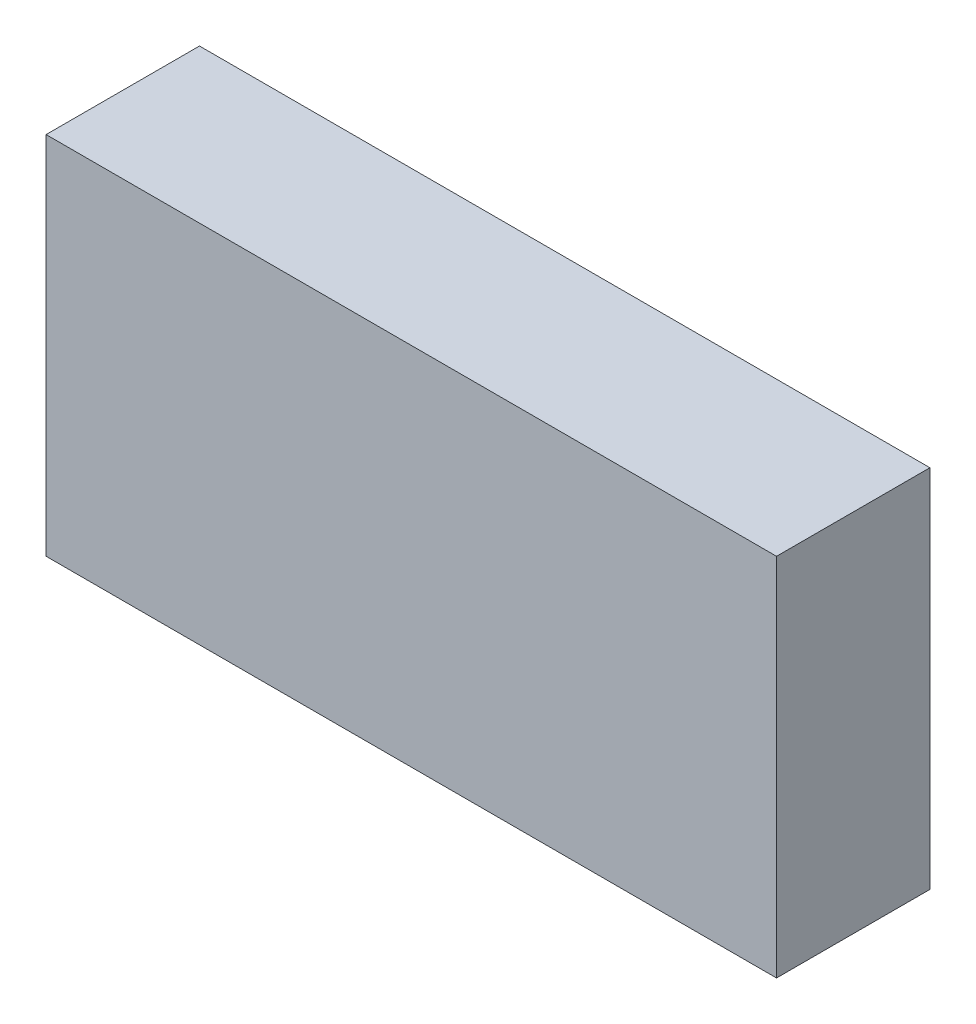
ISO-10303-21;
HEADER;
FILE_DESCRIPTION(('STEP AP214'),'2;1');
FILE_NAME('part.step','',(''),(''),'','','');
FILE_SCHEMA(('AUTOMOTIVE_DESIGN { 1 0 10303 214 1 1 1 1 }'));
ENDSEC;
DATA;
#1=APPLICATION_CONTEXT('core data for automotive mechanical design processes');
#2=APPLICATION_PROTOCOL_DEFINITION('international standard','automotive_design',2000,#1);
#3=PRODUCT_CONTEXT('',#1,'mechanical');
#4=PRODUCT('Part','Part','',(#3));
#5=PRODUCT_RELATED_PRODUCT_CATEGORY('part','',(#4));
#6=PRODUCT_DEFINITION_FORMATION('','',#4);
#7=PRODUCT_DEFINITION_CONTEXT('part definition',#1,'design');
#8=PRODUCT_DEFINITION('design','',#6,#7);
#9=PRODUCT_DEFINITION_SHAPE('','',#8);
#10=(LENGTH_UNIT() NAMED_UNIT(*) SI_UNIT(.MILLI.,.METRE.));
#11=(NAMED_UNIT(*) PLANE_ANGLE_UNIT() SI_UNIT($,.RADIAN.));
#12=(NAMED_UNIT(*) SI_UNIT($,.STERADIAN.) SOLID_ANGLE_UNIT());
#13=UNCERTAINTY_MEASURE_WITH_UNIT(LENGTH_MEASURE(1.E-05),#10,'distance_accuracy_value','');
#14=(GEOMETRIC_REPRESENTATION_CONTEXT(3) GLOBAL_UNCERTAINTY_ASSIGNED_CONTEXT((#13)) GLOBAL_UNIT_ASSIGNED_CONTEXT((#10,
#11,#12)) REPRESENTATION_CONTEXT('',''));
#15=CARTESIAN_POINT('',(0.,0.,0.));
#16=DIRECTION('',(0.,0.,1.));
#17=DIRECTION('',(1.,0.,0.));
#18=AXIS2_PLACEMENT_3D('',#15,#16,#17);
#19=CARTESIAN_POINT('',(0.,0.,5.334));
#20=DIRECTION('',(1.,0.,0.));
#21=DIRECTION('',(0.,1.,0.));
#22=AXIS2_PLACEMENT_3D('',#19,#20,#21);
#23=PLANE('',#22);
#24=DIRECTION('',(0.,-1.,0.));
#25=VECTOR('',#24,1.);
#26=CARTESIAN_POINT('',(0.,0.,0.));
#27=LINE('',#26,#25);
#28=CARTESIAN_POINT('',(0.,0.,0.));
#29=VERTEX_POINT('',#28);
#30=CARTESIAN_POINT('',(0.,-12.7,0.));
#31=VERTEX_POINT('',#30);
#32=EDGE_CURVE('E98',#29,#31,#27,.T.);
#33=ORIENTED_EDGE('',*,*,#32,.T.);
#34=DIRECTION('',(0.,0.,-1.));
#35=VECTOR('',#34,1.);
#36=CARTESIAN_POINT('',(0.,-12.7,5.334));
#37=LINE('',#36,#35);
#38=CARTESIAN_POINT('',(0.,-12.7,5.334));
#39=VERTEX_POINT('',#38);
#40=EDGE_CURVE('E11',#39,#31,#37,.T.);
#41=ORIENTED_EDGE('',*,*,#40,.F.);
#42=DIRECTION('',(0.,-1.,0.));
#43=VECTOR('',#42,1.);
#44=CARTESIAN_POINT('',(0.,0.,5.334));
#45=LINE('',#44,#43);
#46=CARTESIAN_POINT('',(0.,0.,5.334));
#47=VERTEX_POINT('',#46);
#48=EDGE_CURVE('E86',#47,#39,#45,.T.);
#49=ORIENTED_EDGE('',*,*,#48,.F.);
#50=DIRECTION('',(0.,0.,-1.));
#51=VECTOR('',#50,1.);
#52=CARTESIAN_POINT('',(0.,0.,5.334));
#53=LINE('',#52,#51);
#54=EDGE_CURVE('E94',#47,#29,#53,.T.);
#55=ORIENTED_EDGE('',*,*,#54,.T.);
#56=EDGE_LOOP('',(#33,#41,#49,#55));
#57=FACE_BOUND('',#56,.T.);
#58=ADVANCED_FACE('F35',(#57),#23,.F.);
#59=CARTESIAN_POINT('',(0.,-12.7,5.334));
#60=DIRECTION('',(0.,1.,0.));
#61=DIRECTION('',(0.,0.,1.));
#62=AXIS2_PLACEMENT_3D('',#59,#60,#61);
#63=PLANE('',#62);
#64=DIRECTION('',(1.,0.,0.));
#65=VECTOR('',#64,1.);
#66=CARTESIAN_POINT('',(0.,-12.7,0.));
#67=LINE('',#66,#65);
#68=CARTESIAN_POINT('',(25.4,-12.7,0.));
#69=VERTEX_POINT('',#68);
#70=EDGE_CURVE('E90',#31,#69,#67,.T.);
#71=ORIENTED_EDGE('',*,*,#70,.T.);
#72=DIRECTION('',(0.,0.,-1.));
#73=VECTOR('',#72,1.);
#74=CARTESIAN_POINT('',(25.4,-12.7,5.334));
#75=LINE('',#74,#73);
#76=CARTESIAN_POINT('',(25.4,-12.7,5.334));
#77=VERTEX_POINT('',#76);
#78=EDGE_CURVE('E43',#77,#69,#75,.T.);
#79=ORIENTED_EDGE('',*,*,#78,.F.);
#80=DIRECTION('',(1.,0.,0.));
#81=VECTOR('',#80,1.);
#82=CARTESIAN_POINT('',(0.,-12.7,5.334));
#83=LINE('',#82,#81);
#84=EDGE_CURVE('E81',#39,#77,#83,.T.);
#85=ORIENTED_EDGE('',*,*,#84,.F.);
#86=ORIENTED_EDGE('',*,*,#40,.T.);
#87=EDGE_LOOP('',(#71,#79,#85,#86));
#88=FACE_BOUND('',#87,.T.);
#89=ADVANCED_FACE('F89',(#88),#63,.F.);
#90=CARTESIAN_POINT('',(25.4,0.,5.334));
#91=DIRECTION('',(-1.,0.,0.));
#92=DIRECTION('',(0.,-1.,0.));
#93=AXIS2_PLACEMENT_3D('',#90,#91,#92);
#94=PLANE('',#93);
#95=DIRECTION('',(0.,1.,0.));
#96=VECTOR('',#95,1.);
#97=CARTESIAN_POINT('',(25.4,0.,0.));
#98=LINE('',#97,#96);
#99=CARTESIAN_POINT('',(25.4,0.,0.));
#100=VERTEX_POINT('',#99);
#101=EDGE_CURVE('E68',#69,#100,#98,.T.);
#102=ORIENTED_EDGE('',*,*,#101,.T.);
#103=DIRECTION('',(0.,0.,-1.));
#104=VECTOR('',#103,1.);
#105=CARTESIAN_POINT('',(25.4,0.,5.334));
#106=LINE('',#105,#104);
#107=CARTESIAN_POINT('',(25.4,0.,5.334));
#108=VERTEX_POINT('',#107);
#109=EDGE_CURVE('E91',#108,#100,#106,.T.);
#110=ORIENTED_EDGE('',*,*,#109,.F.);
#111=DIRECTION('',(0.,1.,0.));
#112=VECTOR('',#111,1.);
#113=CARTESIAN_POINT('',(25.4,0.,5.334));
#114=LINE('',#113,#112);
#115=EDGE_CURVE('E84',#77,#108,#114,.T.);
#116=ORIENTED_EDGE('',*,*,#115,.F.);
#117=ORIENTED_EDGE('',*,*,#78,.T.);
#118=EDGE_LOOP('',(#102,#110,#116,#117));
#119=FACE_BOUND('',#118,.T.);
#120=ADVANCED_FACE('F92',(#119),#94,.F.);
#121=CARTESIAN_POINT('',(0.,0.,5.334));
#122=DIRECTION('',(0.,-1.,0.));
#123=DIRECTION('',(0.,0.,-1.));
#124=AXIS2_PLACEMENT_3D('',#121,#122,#123);
#125=PLANE('',#124);
#126=DIRECTION('',(-1.,0.,0.));
#127=VECTOR('',#126,1.);
#128=CARTESIAN_POINT('',(0.,0.,0.));
#129=LINE('',#128,#127);
#130=EDGE_CURVE('E74',#100,#29,#129,.T.);
#131=ORIENTED_EDGE('',*,*,#130,.T.);
#132=ORIENTED_EDGE('',*,*,#54,.F.);
#133=DIRECTION('',(-1.,0.,0.));
#134=VECTOR('',#133,1.);
#135=CARTESIAN_POINT('',(0.,0.,5.334));
#136=LINE('',#135,#134);
#137=EDGE_CURVE('E51',#108,#47,#136,.T.);
#138=ORIENTED_EDGE('',*,*,#137,.F.);
#139=ORIENTED_EDGE('',*,*,#109,.T.);
#140=EDGE_LOOP('',(#131,#132,#138,#139));
#141=FACE_BOUND('',#140,.T.);
#142=ADVANCED_FACE('F105',(#141),#125,.F.);
#143=CARTESIAN_POINT('',(0.,0.,5.334));
#144=DIRECTION('',(0.,0.,1.));
#145=DIRECTION('',(1.,0.,0.));
#146=AXIS2_PLACEMENT_3D('',#143,#144,#145);
#147=PLANE('',#146);
#148=ORIENTED_EDGE('',*,*,#48,.T.);
#149=ORIENTED_EDGE('',*,*,#84,.T.);
#150=ORIENTED_EDGE('',*,*,#115,.T.);
#151=ORIENTED_EDGE('',*,*,#137,.T.);
#152=EDGE_LOOP('',(#148,#149,#150,#151));
#153=FACE_BOUND('',#152,.T.);
#154=ADVANCED_FACE('F82',(#153),#147,.T.);
#155=CARTESIAN_POINT('',(0.,0.,0.));
#156=DIRECTION('',(0.,0.,1.));
#157=DIRECTION('',(1.,0.,0.));
#158=AXIS2_PLACEMENT_3D('',#155,#156,#157);
#159=PLANE('',#158);
#160=ORIENTED_EDGE('',*,*,#32,.F.);
#161=ORIENTED_EDGE('',*,*,#130,.F.);
#162=ORIENTED_EDGE('',*,*,#101,.F.);
#163=ORIENTED_EDGE('',*,*,#70,.F.);
#164=EDGE_LOOP('',(#160,#161,#162,#163));
#165=FACE_BOUND('',#164,.T.);
#166=ADVANCED_FACE('F108',(#165),#159,.F.);
#167=CLOSED_SHELL('',(#58,#89,#120,#142,#154,#166));
#168=MANIFOLD_SOLID_BREP('B2',#167);
#169=ADVANCED_BREP_SHAPE_REPRESENTATION('',(#18,#168),#14);
#170=SHAPE_DEFINITION_REPRESENTATION(#9,#169);
ENDSEC;
END-ISO-10303-21;
